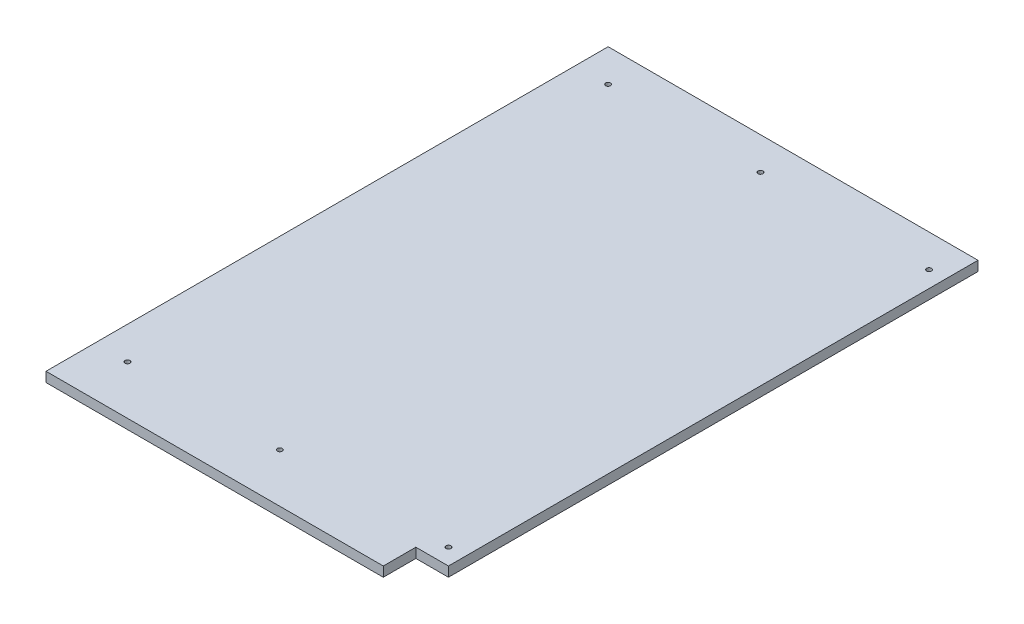
ISO-10303-21;
HEADER;
FILE_DESCRIPTION(('STEP AP214'),'2;1');
FILE_NAME('part.step','',(''),(''),'','','');
FILE_SCHEMA(('AUTOMOTIVE_DESIGN { 1 0 10303 214 1 1 1 1 }'));
ENDSEC;
DATA;
#1=APPLICATION_CONTEXT('core data for automotive mechanical design processes');
#2=APPLICATION_PROTOCOL_DEFINITION('international standard','automotive_design',2000,#1);
#3=PRODUCT_CONTEXT('',#1,'mechanical');
#4=PRODUCT('Part','Part','',(#3));
#5=PRODUCT_RELATED_PRODUCT_CATEGORY('part','',(#4));
#6=PRODUCT_DEFINITION_FORMATION('','',#4);
#7=PRODUCT_DEFINITION_CONTEXT('part definition',#1,'design');
#8=PRODUCT_DEFINITION('design','',#6,#7);
#9=PRODUCT_DEFINITION_SHAPE('','',#8);
#10=(LENGTH_UNIT() NAMED_UNIT(*) SI_UNIT(.MILLI.,.METRE.));
#11=(NAMED_UNIT(*) PLANE_ANGLE_UNIT() SI_UNIT($,.RADIAN.));
#12=(NAMED_UNIT(*) SI_UNIT($,.STERADIAN.) SOLID_ANGLE_UNIT());
#13=UNCERTAINTY_MEASURE_WITH_UNIT(LENGTH_MEASURE(1.E-05),#10,'distance_accuracy_value','');
#14=(GEOMETRIC_REPRESENTATION_CONTEXT(3) GLOBAL_UNCERTAINTY_ASSIGNED_CONTEXT((#13)) GLOBAL_UNIT_ASSIGNED_CONTEXT((#10,
#11,#12)) REPRESENTATION_CONTEXT('',''));
#15=CARTESIAN_POINT('',(0.,0.,0.));
#16=DIRECTION('',(0.,0.,1.));
#17=DIRECTION('',(1.,0.,0.));
#18=AXIS2_PLACEMENT_3D('',#15,#16,#17);
#19=CARTESIAN_POINT('',(0.,6.,0.));
#20=DIRECTION('',(0.,1.,0.));
#21=DIRECTION('',(0.,0.,1.));
#22=AXIS2_PLACEMENT_3D('',#19,#20,#21);
#23=PLANE('',#22);
#24=CARTESIAN_POINT('',(0.77500000000004,6.,201.5));
#25=DIRECTION('',(0.,1.,0.));
#26=DIRECTION('',(0.,0.,1.));
#27=AXIS2_PLACEMENT_3D('',#24,#25,#26);
#28=CIRCLE('',#27,1.5);
#29=CARTESIAN_POINT('',(0.77500000000004,6.,203.));
#30=VERTEX_POINT('',#29);
#31=EDGE_CURVE('E220',#30,#30,#28,.T.);
#32=ORIENTED_EDGE('',*,*,#31,.F.);
#33=EDGE_LOOP('',(#32));
#34=FACE_BOUND('',#33,.T.);
#35=CARTESIAN_POINT('',(0.774999999999998,6.,-93.5));
#36=DIRECTION('',(0.,1.,0.));
#37=DIRECTION('',(0.,0.,1.));
#38=AXIS2_PLACEMENT_3D('',#35,#36,#37);
#39=CIRCLE('',#38,1.5);
#40=CARTESIAN_POINT('',(0.774999999999998,6.,-92.));
#41=VERTEX_POINT('',#40);
#42=EDGE_CURVE('E236',#41,#41,#39,.T.);
#43=ORIENTED_EDGE('',*,*,#42,.F.);
#44=EDGE_LOOP('',(#43));
#45=FACE_BOUND('',#44,.T.);
#46=CARTESIAN_POINT('',(-92.725,6.,-93.5));
#47=DIRECTION('',(0.,1.,0.));
#48=DIRECTION('',(0.,0.,1.));
#49=AXIS2_PLACEMENT_3D('',#46,#47,#48);
#50=CIRCLE('',#49,1.5);
#51=CARTESIAN_POINT('',(-92.725,6.,-92.));
#52=VERTEX_POINT('',#51);
#53=EDGE_CURVE('E134',#52,#52,#50,.T.);
#54=ORIENTED_EDGE('',*,*,#53,.F.);
#55=EDGE_LOOP('',(#54));
#56=FACE_BOUND('',#55,.T.);
#57=DIRECTION('',(0.,0.,1.));
#58=VECTOR('',#57,1.);
#59=CARTESIAN_POINT('',(-112.725,6.,-113.5));
#60=LINE('',#59,#58);
#61=CARTESIAN_POINT('',(-112.725,6.,-113.5));
#62=VERTEX_POINT('',#61);
#63=CARTESIAN_POINT('',(-112.725,6.,231.5));
#64=VERTEX_POINT('',#63);
#65=EDGE_CURVE('E146',#62,#64,#60,.T.);
#66=ORIENTED_EDGE('',*,*,#65,.T.);
#67=DIRECTION('',(1.,0.,0.));
#68=VECTOR('',#67,1.);
#69=CARTESIAN_POINT('',(-112.725,6.,231.5));
#70=LINE('',#69,#68);
#71=CARTESIAN_POINT('',(94.275,6.,231.5));
#72=VERTEX_POINT('',#71);
#73=EDGE_CURVE('E94',#64,#72,#70,.T.);
#74=ORIENTED_EDGE('',*,*,#73,.T.);
#75=DIRECTION('',(0.,0.,-1.));
#76=VECTOR('',#75,1.);
#77=CARTESIAN_POINT('',(94.275,6.,231.5));
#78=LINE('',#77,#76);
#79=CARTESIAN_POINT('',(94.275,6.,211.5));
#80=VERTEX_POINT('',#79);
#81=EDGE_CURVE('E107',#72,#80,#78,.T.);
#82=ORIENTED_EDGE('',*,*,#81,.T.);
#83=DIRECTION('',(1.,0.,0.));
#84=VECTOR('',#83,1.);
#85=CARTESIAN_POINT('',(94.275,6.,211.5));
#86=LINE('',#85,#84);
#87=CARTESIAN_POINT('',(114.275,6.,211.5));
#88=VERTEX_POINT('',#87);
#89=EDGE_CURVE('E101',#80,#88,#86,.T.);
#90=ORIENTED_EDGE('',*,*,#89,.T.);
#91=DIRECTION('',(0.,0.,-1.));
#92=VECTOR('',#91,1.);
#93=CARTESIAN_POINT('',(114.275,6.,-113.5));
#94=LINE('',#93,#92);
#95=CARTESIAN_POINT('',(114.275,6.,-113.5));
#96=VERTEX_POINT('',#95);
#97=EDGE_CURVE('E105',#88,#96,#94,.T.);
#98=ORIENTED_EDGE('',*,*,#97,.T.);
#99=DIRECTION('',(-1.,0.,0.));
#100=VECTOR('',#99,1.);
#101=CARTESIAN_POINT('',(-112.725,6.,-113.5));
#102=LINE('',#101,#100);
#103=EDGE_CURVE('E57',#96,#62,#102,.T.);
#104=ORIENTED_EDGE('',*,*,#103,.T.);
#105=EDGE_LOOP('',(#66,#74,#82,#90,#98,#104));
#106=FACE_BOUND('',#105,.T.);
#107=CARTESIAN_POINT('',(104.275,6.,-93.5));
#108=DIRECTION('',(0.,1.,0.));
#109=DIRECTION('',(0.,0.,1.));
#110=AXIS2_PLACEMENT_3D('',#107,#108,#109);
#111=CIRCLE('',#110,1.5);
#112=CARTESIAN_POINT('',(104.275,6.,-92.));
#113=VERTEX_POINT('',#112);
#114=EDGE_CURVE('E244',#113,#113,#111,.T.);
#115=ORIENTED_EDGE('',*,*,#114,.F.);
#116=EDGE_LOOP('',(#115));
#117=FACE_BOUND('',#116,.T.);
#118=CARTESIAN_POINT('',(-92.725,6.,201.5));
#119=DIRECTION('',(0.,1.,0.));
#120=DIRECTION('',(0.,0.,1.));
#121=AXIS2_PLACEMENT_3D('',#118,#119,#120);
#122=CIRCLE('',#121,1.5);
#123=CARTESIAN_POINT('',(-92.725,6.,203.));
#124=VERTEX_POINT('',#123);
#125=EDGE_CURVE('E228',#124,#124,#122,.T.);
#126=ORIENTED_EDGE('',*,*,#125,.F.);
#127=EDGE_LOOP('',(#126));
#128=FACE_BOUND('',#127,.T.);
#129=CARTESIAN_POINT('',(104.275,6.,201.5));
#130=DIRECTION('',(0.,1.,0.));
#131=DIRECTION('',(0.,0.,1.));
#132=AXIS2_PLACEMENT_3D('',#129,#130,#131);
#133=CIRCLE('',#132,1.5);
#134=CARTESIAN_POINT('',(104.275,6.,203.));
#135=VERTEX_POINT('',#134);
#136=EDGE_CURVE('E209',#135,#135,#133,.T.);
#137=ORIENTED_EDGE('',*,*,#136,.F.);
#138=EDGE_LOOP('',(#137));
#139=FACE_BOUND('',#138,.T.);
#140=ADVANCED_FACE('F39',(#34,#45,#56,#106,#117,#128,#139),#23,.T.);
#141=CARTESIAN_POINT('',(0.,0.,0.));
#142=DIRECTION('',(0.,1.,0.));
#143=DIRECTION('',(0.,0.,1.));
#144=AXIS2_PLACEMENT_3D('',#141,#142,#143);
#145=PLANE('',#144);
#146=DIRECTION('',(0.,0.,1.));
#147=VECTOR('',#146,1.);
#148=CARTESIAN_POINT('',(-112.725,0.,-113.5));
#149=LINE('',#148,#147);
#150=CARTESIAN_POINT('',(-112.725,0.,-113.5));
#151=VERTEX_POINT('',#150);
#152=CARTESIAN_POINT('',(-112.725,0.,231.5));
#153=VERTEX_POINT('',#152);
#154=EDGE_CURVE('E129',#151,#153,#149,.T.);
#155=ORIENTED_EDGE('',*,*,#154,.F.);
#156=DIRECTION('',(-1.,0.,0.));
#157=VECTOR('',#156,1.);
#158=CARTESIAN_POINT('',(-112.725,0.,-113.5));
#159=LINE('',#158,#157);
#160=CARTESIAN_POINT('',(114.275,0.,-113.5));
#161=VERTEX_POINT('',#160);
#162=EDGE_CURVE('E86',#161,#151,#159,.T.);
#163=ORIENTED_EDGE('',*,*,#162,.F.);
#164=DIRECTION('',(0.,0.,-1.));
#165=VECTOR('',#164,1.);
#166=CARTESIAN_POINT('',(114.275,0.,-113.5));
#167=LINE('',#166,#165);
#168=CARTESIAN_POINT('',(114.275,0.,211.5));
#169=VERTEX_POINT('',#168);
#170=EDGE_CURVE('E80',#169,#161,#167,.T.);
#171=ORIENTED_EDGE('',*,*,#170,.F.);
#172=DIRECTION('',(1.,0.,0.));
#173=VECTOR('',#172,1.);
#174=CARTESIAN_POINT('',(94.275,0.,211.5));
#175=LINE('',#174,#173);
#176=CARTESIAN_POINT('',(94.275,0.,211.5));
#177=VERTEX_POINT('',#176);
#178=EDGE_CURVE('E116',#177,#169,#175,.T.);
#179=ORIENTED_EDGE('',*,*,#178,.F.);
#180=DIRECTION('',(0.,0.,-1.));
#181=VECTOR('',#180,1.);
#182=CARTESIAN_POINT('',(94.275,0.,231.5));
#183=LINE('',#182,#181);
#184=CARTESIAN_POINT('',(94.275,0.,231.5));
#185=VERTEX_POINT('',#184);
#186=EDGE_CURVE('E137',#185,#177,#183,.T.);
#187=ORIENTED_EDGE('',*,*,#186,.F.);
#188=DIRECTION('',(1.,0.,0.));
#189=VECTOR('',#188,1.);
#190=CARTESIAN_POINT('',(-112.725,0.,231.5));
#191=LINE('',#190,#189);
#192=EDGE_CURVE('E133',#153,#185,#191,.T.);
#193=ORIENTED_EDGE('',*,*,#192,.F.);
#194=EDGE_LOOP('',(#155,#163,#171,#179,#187,#193));
#195=FACE_BOUND('',#194,.T.);
#196=CARTESIAN_POINT('',(-92.725,0.,-93.5));
#197=DIRECTION('',(0.,1.,0.));
#198=DIRECTION('',(0.,0.,1.));
#199=AXIS2_PLACEMENT_3D('',#196,#197,#198);
#200=CIRCLE('',#199,1.5);
#201=CARTESIAN_POINT('',(-92.725,0.,-92.));
#202=VERTEX_POINT('',#201);
#203=EDGE_CURVE('E248',#202,#202,#200,.T.);
#204=ORIENTED_EDGE('',*,*,#203,.T.);
#205=EDGE_LOOP('',(#204));
#206=FACE_BOUND('',#205,.T.);
#207=CARTESIAN_POINT('',(104.275,0.,-93.5));
#208=DIRECTION('',(0.,1.,0.));
#209=DIRECTION('',(0.,0.,1.));
#210=AXIS2_PLACEMENT_3D('',#207,#208,#209);
#211=CIRCLE('',#210,1.5);
#212=CARTESIAN_POINT('',(104.275,0.,-92.));
#213=VERTEX_POINT('',#212);
#214=EDGE_CURVE('E240',#213,#213,#211,.T.);
#215=ORIENTED_EDGE('',*,*,#214,.T.);
#216=EDGE_LOOP('',(#215));
#217=FACE_BOUND('',#216,.T.);
#218=CARTESIAN_POINT('',(0.774999999999998,0.,-93.5));
#219=DIRECTION('',(0.,1.,0.));
#220=DIRECTION('',(0.,0.,1.));
#221=AXIS2_PLACEMENT_3D('',#218,#219,#220);
#222=CIRCLE('',#221,1.5);
#223=CARTESIAN_POINT('',(0.774999999999998,0.,-92.));
#224=VERTEX_POINT('',#223);
#225=EDGE_CURVE('E232',#224,#224,#222,.T.);
#226=ORIENTED_EDGE('',*,*,#225,.T.);
#227=EDGE_LOOP('',(#226));
#228=FACE_BOUND('',#227,.T.);
#229=CARTESIAN_POINT('',(-92.725,0.,201.5));
#230=DIRECTION('',(0.,1.,0.));
#231=DIRECTION('',(0.,0.,1.));
#232=AXIS2_PLACEMENT_3D('',#229,#230,#231);
#233=CIRCLE('',#232,1.5);
#234=CARTESIAN_POINT('',(-92.725,0.,203.));
#235=VERTEX_POINT('',#234);
#236=EDGE_CURVE('E224',#235,#235,#233,.T.);
#237=ORIENTED_EDGE('',*,*,#236,.T.);
#238=EDGE_LOOP('',(#237));
#239=FACE_BOUND('',#238,.T.);
#240=CARTESIAN_POINT('',(0.77500000000004,0.,201.5));
#241=DIRECTION('',(0.,1.,0.));
#242=DIRECTION('',(0.,0.,1.));
#243=AXIS2_PLACEMENT_3D('',#240,#241,#242);
#244=CIRCLE('',#243,1.5);
#245=CARTESIAN_POINT('',(0.77500000000004,0.,203.));
#246=VERTEX_POINT('',#245);
#247=EDGE_CURVE('E217',#246,#246,#244,.T.);
#248=ORIENTED_EDGE('',*,*,#247,.T.);
#249=EDGE_LOOP('',(#248));
#250=FACE_BOUND('',#249,.T.);
#251=CARTESIAN_POINT('',(104.275,0.,201.5));
#252=DIRECTION('',(0.,1.,0.));
#253=DIRECTION('',(0.,0.,1.));
#254=AXIS2_PLACEMENT_3D('',#251,#252,#253);
#255=CIRCLE('',#254,1.5);
#256=CARTESIAN_POINT('',(104.275,0.,203.));
#257=VERTEX_POINT('',#256);
#258=EDGE_CURVE('E212',#257,#257,#255,.T.);
#259=ORIENTED_EDGE('',*,*,#258,.T.);
#260=EDGE_LOOP('',(#259));
#261=FACE_BOUND('',#260,.T.);
#262=ADVANCED_FACE('F159',(#195,#206,#217,#228,#239,#250,#261),#145,.F.);
#263=CARTESIAN_POINT('',(-112.725,6.,-113.5));
#264=DIRECTION('',(1.,0.,0.));
#265=DIRECTION('',(0.,0.,-1.));
#266=AXIS2_PLACEMENT_3D('',#263,#264,#265);
#267=PLANE('',#266);
#268=ORIENTED_EDGE('',*,*,#154,.T.);
#269=DIRECTION('',(0.,-1.,0.));
#270=VECTOR('',#269,1.);
#271=CARTESIAN_POINT('',(-112.725,6.,231.5));
#272=LINE('',#271,#270);
#273=EDGE_CURVE('E11',#64,#153,#272,.T.);
#274=ORIENTED_EDGE('',*,*,#273,.F.);
#275=ORIENTED_EDGE('',*,*,#65,.F.);
#276=DIRECTION('',(0.,-1.,0.));
#277=VECTOR('',#276,1.);
#278=CARTESIAN_POINT('',(-112.725,6.,-113.5));
#279=LINE('',#278,#277);
#280=EDGE_CURVE('E125',#62,#151,#279,.T.);
#281=ORIENTED_EDGE('',*,*,#280,.T.);
#282=EDGE_LOOP('',(#268,#274,#275,#281));
#283=FACE_BOUND('',#282,.T.);
#284=ADVANCED_FACE('F41',(#283),#267,.F.);
#285=CARTESIAN_POINT('',(-112.725,6.,231.5));
#286=DIRECTION('',(0.,0.,-1.));
#287=DIRECTION('',(-1.,0.,0.));
#288=AXIS2_PLACEMENT_3D('',#285,#286,#287);
#289=PLANE('',#288);
#290=ORIENTED_EDGE('',*,*,#192,.T.);
#291=DIRECTION('',(0.,-1.,0.));
#292=VECTOR('',#291,1.);
#293=CARTESIAN_POINT('',(94.275,6.,231.5));
#294=LINE('',#293,#292);
#295=EDGE_CURVE('E49',#72,#185,#294,.T.);
#296=ORIENTED_EDGE('',*,*,#295,.F.);
#297=ORIENTED_EDGE('',*,*,#73,.F.);
#298=ORIENTED_EDGE('',*,*,#273,.T.);
#299=EDGE_LOOP('',(#290,#296,#297,#298));
#300=FACE_BOUND('',#299,.T.);
#301=ADVANCED_FACE('F330',(#300),#289,.F.);
#302=CARTESIAN_POINT('',(94.275,6.,231.5));
#303=DIRECTION('',(-1.,0.,0.));
#304=DIRECTION('',(0.,0.,1.));
#305=AXIS2_PLACEMENT_3D('',#302,#303,#304);
#306=PLANE('',#305);
#307=ORIENTED_EDGE('',*,*,#186,.T.);
#308=DIRECTION('',(0.,-1.,0.));
#309=VECTOR('',#308,1.);
#310=CARTESIAN_POINT('',(94.275,6.,211.5));
#311=LINE('',#310,#309);
#312=EDGE_CURVE('E118',#80,#177,#311,.T.);
#313=ORIENTED_EDGE('',*,*,#312,.F.);
#314=ORIENTED_EDGE('',*,*,#81,.F.);
#315=ORIENTED_EDGE('',*,*,#295,.T.);
#316=EDGE_LOOP('',(#307,#313,#314,#315));
#317=FACE_BOUND('',#316,.T.);
#318=ADVANCED_FACE('F156',(#317),#306,.F.);
#319=CARTESIAN_POINT('',(94.275,6.,211.5));
#320=DIRECTION('',(0.,0.,-1.));
#321=DIRECTION('',(-1.,0.,0.));
#322=AXIS2_PLACEMENT_3D('',#319,#320,#321);
#323=PLANE('',#322);
#324=ORIENTED_EDGE('',*,*,#178,.T.);
#325=DIRECTION('',(0.,-1.,0.));
#326=VECTOR('',#325,1.);
#327=CARTESIAN_POINT('',(114.275,6.,211.5));
#328=LINE('',#327,#326);
#329=EDGE_CURVE('E113',#88,#169,#328,.T.);
#330=ORIENTED_EDGE('',*,*,#329,.F.);
#331=ORIENTED_EDGE('',*,*,#89,.F.);
#332=ORIENTED_EDGE('',*,*,#312,.T.);
#333=EDGE_LOOP('',(#324,#330,#331,#332));
#334=FACE_BOUND('',#333,.T.);
#335=ADVANCED_FACE('F114',(#334),#323,.F.);
#336=CARTESIAN_POINT('',(114.275,6.,-113.5));
#337=DIRECTION('',(-1.,0.,0.));
#338=DIRECTION('',(0.,0.,1.));
#339=AXIS2_PLACEMENT_3D('',#336,#337,#338);
#340=PLANE('',#339);
#341=ORIENTED_EDGE('',*,*,#170,.T.);
#342=DIRECTION('',(0.,-1.,0.));
#343=VECTOR('',#342,1.);
#344=CARTESIAN_POINT('',(114.275,6.,-113.5));
#345=LINE('',#344,#343);
#346=EDGE_CURVE('E119',#96,#161,#345,.T.);
#347=ORIENTED_EDGE('',*,*,#346,.F.);
#348=ORIENTED_EDGE('',*,*,#97,.F.);
#349=ORIENTED_EDGE('',*,*,#329,.T.);
#350=EDGE_LOOP('',(#341,#347,#348,#349));
#351=FACE_BOUND('',#350,.T.);
#352=ADVANCED_FACE('F121',(#351),#340,.F.);
#353=CARTESIAN_POINT('',(-112.725,6.,-113.5));
#354=DIRECTION('',(0.,0.,1.));
#355=DIRECTION('',(1.,0.,0.));
#356=AXIS2_PLACEMENT_3D('',#353,#354,#355);
#357=PLANE('',#356);
#358=ORIENTED_EDGE('',*,*,#162,.T.);
#359=ORIENTED_EDGE('',*,*,#280,.F.);
#360=ORIENTED_EDGE('',*,*,#103,.F.);
#361=ORIENTED_EDGE('',*,*,#346,.T.);
#362=EDGE_LOOP('',(#358,#359,#360,#361));
#363=FACE_BOUND('',#362,.T.);
#364=ADVANCED_FACE('F164',(#363),#357,.F.);
#365=CARTESIAN_POINT('',(-92.725,6.,-93.5));
#366=DIRECTION('',(0.,-1.,0.));
#367=DIRECTION('',(0.,0.,-1.));
#368=AXIS2_PLACEMENT_3D('',#365,#366,#367);
#369=CYLINDRICAL_SURFACE('',#368,1.5);
#370=ORIENTED_EDGE('',*,*,#53,.T.);
#371=EDGE_LOOP('',(#370));
#372=FACE_BOUND('',#371,.T.);
#373=ORIENTED_EDGE('',*,*,#203,.F.);
#374=EDGE_LOOP('',(#373));
#375=FACE_BOUND('',#374,.T.);
#376=ADVANCED_FACE('F166',(#372,#375),#369,.F.);
#377=CARTESIAN_POINT('',(104.275,6.,-93.5));
#378=DIRECTION('',(0.,-1.,0.));
#379=DIRECTION('',(0.,0.,-1.));
#380=AXIS2_PLACEMENT_3D('',#377,#378,#379);
#381=CYLINDRICAL_SURFACE('',#380,1.5);
#382=ORIENTED_EDGE('',*,*,#114,.T.);
#383=EDGE_LOOP('',(#382));
#384=FACE_BOUND('',#383,.T.);
#385=ORIENTED_EDGE('',*,*,#214,.F.);
#386=EDGE_LOOP('',(#385));
#387=FACE_BOUND('',#386,.T.);
#388=ADVANCED_FACE('F172',(#384,#387),#381,.F.);
#389=CARTESIAN_POINT('',(0.774999999999998,6.,-93.5));
#390=DIRECTION('',(0.,-1.,0.));
#391=DIRECTION('',(0.,0.,-1.));
#392=AXIS2_PLACEMENT_3D('',#389,#390,#391);
#393=CYLINDRICAL_SURFACE('',#392,1.5);
#394=ORIENTED_EDGE('',*,*,#42,.T.);
#395=EDGE_LOOP('',(#394));
#396=FACE_BOUND('',#395,.T.);
#397=ORIENTED_EDGE('',*,*,#225,.F.);
#398=EDGE_LOOP('',(#397));
#399=FACE_BOUND('',#398,.T.);
#400=ADVANCED_FACE('F188',(#396,#399),#393,.F.);
#401=CARTESIAN_POINT('',(-92.725,6.,201.5));
#402=DIRECTION('',(0.,-1.,0.));
#403=DIRECTION('',(0.,0.,-1.));
#404=AXIS2_PLACEMENT_3D('',#401,#402,#403);
#405=CYLINDRICAL_SURFACE('',#404,1.5);
#406=ORIENTED_EDGE('',*,*,#125,.T.);
#407=EDGE_LOOP('',(#406));
#408=FACE_BOUND('',#407,.T.);
#409=ORIENTED_EDGE('',*,*,#236,.F.);
#410=EDGE_LOOP('',(#409));
#411=FACE_BOUND('',#410,.T.);
#412=ADVANCED_FACE('F192',(#408,#411),#405,.F.);
#413=CARTESIAN_POINT('',(0.77500000000004,6.,201.5));
#414=DIRECTION('',(0.,-1.,0.));
#415=DIRECTION('',(0.,0.,-1.));
#416=AXIS2_PLACEMENT_3D('',#413,#414,#415);
#417=CYLINDRICAL_SURFACE('',#416,1.5);
#418=ORIENTED_EDGE('',*,*,#31,.T.);
#419=EDGE_LOOP('',(#418));
#420=FACE_BOUND('',#419,.T.);
#421=ORIENTED_EDGE('',*,*,#247,.F.);
#422=EDGE_LOOP('',(#421));
#423=FACE_BOUND('',#422,.T.);
#424=ADVANCED_FACE('F196',(#420,#423),#417,.F.);
#425=CARTESIAN_POINT('',(104.275,6.,201.5));
#426=DIRECTION('',(0.,-1.,0.));
#427=DIRECTION('',(0.,0.,-1.));
#428=AXIS2_PLACEMENT_3D('',#425,#426,#427);
#429=CYLINDRICAL_SURFACE('',#428,1.5);
#430=ORIENTED_EDGE('',*,*,#136,.T.);
#431=EDGE_LOOP('',(#430));
#432=FACE_BOUND('',#431,.T.);
#433=ORIENTED_EDGE('',*,*,#258,.F.);
#434=EDGE_LOOP('',(#433));
#435=FACE_BOUND('',#434,.T.);
#436=ADVANCED_FACE('F200',(#432,#435),#429,.F.);
#437=CLOSED_SHELL('',(#140,#262,#284,#301,#318,#335,#352,#364,#376,#388,#400,#412,#424,#436));
#438=MANIFOLD_SOLID_BREP('B2',#437);
#439=ADVANCED_BREP_SHAPE_REPRESENTATION('',(#18,#438),#14);
#440=SHAPE_DEFINITION_REPRESENTATION(#9,#439);
ENDSEC;
END-ISO-10303-21;
